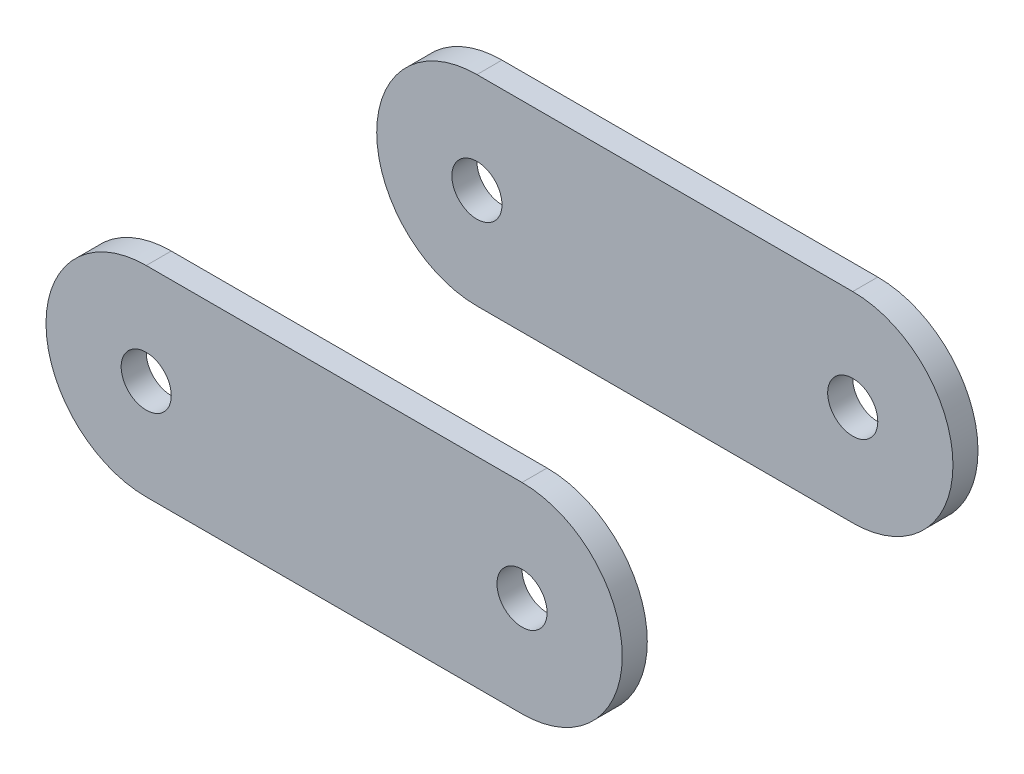
ISO-10303-21;
HEADER;
FILE_DESCRIPTION(('STEP AP214'),'2;1');
FILE_NAME('part.step','',(''),(''),'','','');
FILE_SCHEMA(('AUTOMOTIVE_DESIGN { 1 0 10303 214 1 1 1 1 }'));
ENDSEC;
DATA;
#1=APPLICATION_CONTEXT('core data for automotive mechanical design processes');
#2=APPLICATION_PROTOCOL_DEFINITION('international standard','automotive_design',2000,#1);
#3=PRODUCT_CONTEXT('',#1,'mechanical');
#4=PRODUCT('Part','Part','',(#3));
#5=PRODUCT_RELATED_PRODUCT_CATEGORY('part','',(#4));
#6=PRODUCT_DEFINITION_FORMATION('','',#4);
#7=PRODUCT_DEFINITION_CONTEXT('part definition',#1,'design');
#8=PRODUCT_DEFINITION('design','',#6,#7);
#9=PRODUCT_DEFINITION_SHAPE('','',#8);
#10=(LENGTH_UNIT() NAMED_UNIT(*) SI_UNIT(.MILLI.,.METRE.));
#11=(NAMED_UNIT(*) PLANE_ANGLE_UNIT() SI_UNIT($,.RADIAN.));
#12=(NAMED_UNIT(*) SI_UNIT($,.STERADIAN.) SOLID_ANGLE_UNIT());
#13=UNCERTAINTY_MEASURE_WITH_UNIT(LENGTH_MEASURE(1.E-05),#10,'distance_accuracy_value','');
#14=(GEOMETRIC_REPRESENTATION_CONTEXT(3) GLOBAL_UNCERTAINTY_ASSIGNED_CONTEXT((#13)) GLOBAL_UNIT_ASSIGNED_CONTEXT((#10,
#11,#12)) REPRESENTATION_CONTEXT('',''));
#15=CARTESIAN_POINT('',(0.,0.,0.));
#16=DIRECTION('',(0.,0.,1.));
#17=DIRECTION('',(1.,0.,0.));
#18=AXIS2_PLACEMENT_3D('',#15,#16,#17);
#19=CARTESIAN_POINT('',(0.,20.,-61.));
#20=DIRECTION('',(0.,0.,-1.));
#21=DIRECTION('',(-1.,0.,0.));
#22=AXIS2_PLACEMENT_3D('',#19,#20,#21);
#23=PLANE('',#22);
#24=CARTESIAN_POINT('',(0.,20.,-61.));
#25=DIRECTION('',(0.,0.,1.));
#26=DIRECTION('',(-1.,0.,0.));
#27=AXIS2_PLACEMENT_3D('',#24,#25,#26);
#28=CIRCLE('',#27,20.);
#29=CARTESIAN_POINT('',(0.,40.,-61.));
#30=VERTEX_POINT('',#29);
#31=CARTESIAN_POINT('',(0.,0.,-61.));
#32=VERTEX_POINT('',#31);
#33=EDGE_CURVE('E95',#30,#32,#28,.T.);
#34=ORIENTED_EDGE('',*,*,#33,.T.);
#35=DIRECTION('',(1.,0.,0.));
#36=VECTOR('',#35,1.);
#37=CARTESIAN_POINT('',(0.,0.,-61.));
#38=LINE('',#37,#36);
#39=CARTESIAN_POINT('',(75.,0.,-61.));
#40=VERTEX_POINT('',#39);
#41=EDGE_CURVE('E90',#32,#40,#38,.T.);
#42=ORIENTED_EDGE('',*,*,#41,.T.);
#43=CARTESIAN_POINT('',(75.,20.,-61.));
#44=DIRECTION('',(0.,0.,1.));
#45=DIRECTION('',(1.,0.,0.));
#46=AXIS2_PLACEMENT_3D('',#43,#44,#45);
#47=CIRCLE('',#46,20.);
#48=CARTESIAN_POINT('',(75.,40.,-61.));
#49=VERTEX_POINT('',#48);
#50=EDGE_CURVE('E93',#40,#49,#47,.T.);
#51=ORIENTED_EDGE('',*,*,#50,.T.);
#52=DIRECTION('',(-1.,0.,0.));
#53=VECTOR('',#52,1.);
#54=CARTESIAN_POINT('',(0.,40.,-61.));
#55=LINE('',#54,#53);
#56=EDGE_CURVE('E60',#49,#30,#55,.T.);
#57=ORIENTED_EDGE('',*,*,#56,.T.);
#58=EDGE_LOOP('',(#34,#42,#51,#57));
#59=FACE_BOUND('',#58,.T.);
#60=CARTESIAN_POINT('',(0.,20.,-61.));
#61=DIRECTION('',(0.,0.,1.));
#62=DIRECTION('',(1.,0.,0.));
#63=AXIS2_PLACEMENT_3D('',#60,#61,#62);
#64=CIRCLE('',#63,5.);
#65=CARTESIAN_POINT('',(5.,20.,-61.));
#66=VERTEX_POINT('',#65);
#67=EDGE_CURVE('E110',#66,#66,#64,.T.);
#68=ORIENTED_EDGE('',*,*,#67,.F.);
#69=EDGE_LOOP('',(#68));
#70=FACE_BOUND('',#69,.T.);
#71=CARTESIAN_POINT('',(75.,20.,-61.));
#72=DIRECTION('',(0.,0.,1.));
#73=DIRECTION('',(1.,0.,0.));
#74=AXIS2_PLACEMENT_3D('',#71,#72,#73);
#75=CIRCLE('',#74,5.);
#76=CARTESIAN_POINT('',(80.,20.,-61.));
#77=VERTEX_POINT('',#76);
#78=EDGE_CURVE('E125',#77,#77,#75,.T.);
#79=ORIENTED_EDGE('',*,*,#78,.F.);
#80=EDGE_LOOP('',(#79));
#81=FACE_BOUND('',#80,.T.);
#82=ADVANCED_FACE('F43',(#59,#70,#81),#23,.F.);
#83=CARTESIAN_POINT('',(0.,20.,-66.));
#84=DIRECTION('',(0.,0.,-1.));
#85=DIRECTION('',(-1.,0.,0.));
#86=AXIS2_PLACEMENT_3D('',#83,#84,#85);
#87=PLANE('',#86);
#88=CARTESIAN_POINT('',(0.,20.,-66.));
#89=DIRECTION('',(0.,0.,1.));
#90=DIRECTION('',(1.,0.,0.));
#91=AXIS2_PLACEMENT_3D('',#88,#89,#90);
#92=CIRCLE('',#91,5.);
#93=CARTESIAN_POINT('',(5.,20.,-66.));
#94=VERTEX_POINT('',#93);
#95=EDGE_CURVE('E122',#94,#94,#92,.T.);
#96=ORIENTED_EDGE('',*,*,#95,.T.);
#97=EDGE_LOOP('',(#96));
#98=FACE_BOUND('',#97,.T.);
#99=CARTESIAN_POINT('',(0.,20.,-66.));
#100=DIRECTION('',(0.,0.,1.));
#101=DIRECTION('',(-1.,0.,0.));
#102=AXIS2_PLACEMENT_3D('',#99,#100,#101);
#103=CIRCLE('',#102,20.);
#104=CARTESIAN_POINT('',(0.,40.,-66.));
#105=VERTEX_POINT('',#104);
#106=CARTESIAN_POINT('',(0.,0.,-66.));
#107=VERTEX_POINT('',#106);
#108=EDGE_CURVE('E107',#105,#107,#103,.T.);
#109=ORIENTED_EDGE('',*,*,#108,.F.);
#110=DIRECTION('',(-1.,0.,0.));
#111=VECTOR('',#110,1.);
#112=CARTESIAN_POINT('',(0.,40.,-66.));
#113=LINE('',#112,#111);
#114=CARTESIAN_POINT('',(75.,40.,-66.));
#115=VERTEX_POINT('',#114);
#116=EDGE_CURVE('E83',#115,#105,#113,.T.);
#117=ORIENTED_EDGE('',*,*,#116,.F.);
#118=CARTESIAN_POINT('',(75.,20.,-66.));
#119=DIRECTION('',(0.,0.,1.));
#120=DIRECTION('',(1.,0.,0.));
#121=AXIS2_PLACEMENT_3D('',#118,#119,#120);
#122=CIRCLE('',#121,20.);
#123=CARTESIAN_POINT('',(75.,0.,-66.));
#124=VERTEX_POINT('',#123);
#125=EDGE_CURVE('E77',#124,#115,#122,.T.);
#126=ORIENTED_EDGE('',*,*,#125,.F.);
#127=DIRECTION('',(1.,0.,0.));
#128=VECTOR('',#127,1.);
#129=CARTESIAN_POINT('',(0.,0.,-66.));
#130=LINE('',#129,#128);
#131=EDGE_CURVE('E99',#107,#124,#130,.T.);
#132=ORIENTED_EDGE('',*,*,#131,.F.);
#133=EDGE_LOOP('',(#109,#117,#126,#132));
#134=FACE_BOUND('',#133,.T.);
#135=CARTESIAN_POINT('',(75.,20.,-66.));
#136=DIRECTION('',(0.,0.,1.));
#137=DIRECTION('',(1.,0.,0.));
#138=AXIS2_PLACEMENT_3D('',#135,#136,#137);
#139=CIRCLE('',#138,5.);
#140=CARTESIAN_POINT('',(80.,20.,-66.));
#141=VERTEX_POINT('',#140);
#142=EDGE_CURVE('E128',#141,#141,#139,.T.);
#143=ORIENTED_EDGE('',*,*,#142,.T.);
#144=EDGE_LOOP('',(#143));
#145=FACE_BOUND('',#144,.T.);
#146=ADVANCED_FACE('F118',(#98,#134,#145),#87,.T.);
#147=CARTESIAN_POINT('',(0.,20.,-61.));
#148=DIRECTION('',(0.,0.,-1.));
#149=DIRECTION('',(-1.,0.,0.));
#150=AXIS2_PLACEMENT_3D('',#147,#148,#149);
#151=CYLINDRICAL_SURFACE('',#150,20.);
#152=ORIENTED_EDGE('',*,*,#108,.T.);
#153=DIRECTION('',(0.,0.,-1.));
#154=VECTOR('',#153,1.);
#155=CARTESIAN_POINT('',(0.,0.,-61.));
#156=LINE('',#155,#154);
#157=EDGE_CURVE('E12',#32,#107,#156,.T.);
#158=ORIENTED_EDGE('',*,*,#157,.F.);
#159=ORIENTED_EDGE('',*,*,#33,.F.);
#160=DIRECTION('',(0.,0.,-1.));
#161=VECTOR('',#160,1.);
#162=CARTESIAN_POINT('',(0.,40.,-61.));
#163=LINE('',#162,#161);
#164=EDGE_CURVE('E103',#30,#105,#163,.T.);
#165=ORIENTED_EDGE('',*,*,#164,.T.);
#166=EDGE_LOOP('',(#152,#158,#159,#165));
#167=FACE_BOUND('',#166,.T.);
#168=ADVANCED_FACE('F45',(#167),#151,.T.);
#169=CARTESIAN_POINT('',(0.,0.,-61.));
#170=DIRECTION('',(0.,1.,0.));
#171=DIRECTION('',(0.,0.,1.));
#172=AXIS2_PLACEMENT_3D('',#169,#170,#171);
#173=PLANE('',#172);
#174=ORIENTED_EDGE('',*,*,#131,.T.);
#175=DIRECTION('',(0.,0.,-1.));
#176=VECTOR('',#175,1.);
#177=CARTESIAN_POINT('',(75.,0.,-61.));
#178=LINE('',#177,#176);
#179=EDGE_CURVE('E52',#40,#124,#178,.T.);
#180=ORIENTED_EDGE('',*,*,#179,.F.);
#181=ORIENTED_EDGE('',*,*,#41,.F.);
#182=ORIENTED_EDGE('',*,*,#157,.T.);
#183=EDGE_LOOP('',(#174,#180,#181,#182));
#184=FACE_BOUND('',#183,.T.);
#185=ADVANCED_FACE('F98',(#184),#173,.F.);
#186=CARTESIAN_POINT('',(75.,20.,-61.));
#187=DIRECTION('',(0.,0.,-1.));
#188=DIRECTION('',(-1.,0.,0.));
#189=AXIS2_PLACEMENT_3D('',#186,#187,#188);
#190=CYLINDRICAL_SURFACE('',#189,20.);
#191=ORIENTED_EDGE('',*,*,#125,.T.);
#192=DIRECTION('',(0.,0.,-1.));
#193=VECTOR('',#192,1.);
#194=CARTESIAN_POINT('',(75.,40.,-61.));
#195=LINE('',#194,#193);
#196=EDGE_CURVE('E100',#49,#115,#195,.T.);
#197=ORIENTED_EDGE('',*,*,#196,.F.);
#198=ORIENTED_EDGE('',*,*,#50,.F.);
#199=ORIENTED_EDGE('',*,*,#179,.T.);
#200=EDGE_LOOP('',(#191,#197,#198,#199));
#201=FACE_BOUND('',#200,.T.);
#202=ADVANCED_FACE('F101',(#201),#190,.T.);
#203=CARTESIAN_POINT('',(0.,40.,-61.));
#204=DIRECTION('',(0.,-1.,0.));
#205=DIRECTION('',(0.,0.,-1.));
#206=AXIS2_PLACEMENT_3D('',#203,#204,#205);
#207=PLANE('',#206);
#208=ORIENTED_EDGE('',*,*,#116,.T.);
#209=ORIENTED_EDGE('',*,*,#164,.F.);
#210=ORIENTED_EDGE('',*,*,#56,.F.);
#211=ORIENTED_EDGE('',*,*,#196,.T.);
#212=EDGE_LOOP('',(#208,#209,#210,#211));
#213=FACE_BOUND('',#212,.T.);
#214=ADVANCED_FACE('F115',(#213),#207,.F.);
#215=CARTESIAN_POINT('',(0.,20.,-61.));
#216=DIRECTION('',(0.,0.,-1.));
#217=DIRECTION('',(-1.,0.,0.));
#218=AXIS2_PLACEMENT_3D('',#215,#216,#217);
#219=CYLINDRICAL_SURFACE('',#218,5.);
#220=ORIENTED_EDGE('',*,*,#67,.T.);
#221=EDGE_LOOP('',(#220));
#222=FACE_BOUND('',#221,.T.);
#223=ORIENTED_EDGE('',*,*,#95,.F.);
#224=EDGE_LOOP('',(#223));
#225=FACE_BOUND('',#224,.T.);
#226=ADVANCED_FACE('F145',(#222,#225),#219,.F.);
#227=CARTESIAN_POINT('',(75.,20.,-61.));
#228=DIRECTION('',(0.,0.,-1.));
#229=DIRECTION('',(-1.,0.,0.));
#230=AXIS2_PLACEMENT_3D('',#227,#228,#229);
#231=CYLINDRICAL_SURFACE('',#230,5.);
#232=ORIENTED_EDGE('',*,*,#78,.T.);
#233=EDGE_LOOP('',(#232));
#234=FACE_BOUND('',#233,.T.);
#235=ORIENTED_EDGE('',*,*,#142,.F.);
#236=EDGE_LOOP('',(#235));
#237=FACE_BOUND('',#236,.T.);
#238=ADVANCED_FACE('F134',(#234,#237),#231,.F.);
#239=CLOSED_SHELL('',(#82,#146,#168,#185,#202,#214,#226,#238));
#240=MANIFOLD_SOLID_BREP('B2',#239);
#241=CARTESIAN_POINT('',(0.,20.,5.));
#242=DIRECTION('',(0.,0.,-1.));
#243=DIRECTION('',(-1.,0.,0.));
#244=AXIS2_PLACEMENT_3D('',#241,#242,#243);
#245=PLANE('',#244);
#246=CARTESIAN_POINT('',(0.,20.,5.));
#247=DIRECTION('',(0.,0.,1.));
#248=DIRECTION('',(-1.,0.,0.));
#249=AXIS2_PLACEMENT_3D('',#246,#247,#248);
#250=CIRCLE('',#249,20.);
#251=CARTESIAN_POINT('',(0.,40.,5.));
#252=VERTEX_POINT('',#251);
#253=CARTESIAN_POINT('',(0.,0.,5.));
#254=VERTEX_POINT('',#253);
#255=EDGE_CURVE('E261',#252,#254,#250,.T.);
#256=ORIENTED_EDGE('',*,*,#255,.T.);
#257=DIRECTION('',(1.,0.,0.));
#258=VECTOR('',#257,1.);
#259=CARTESIAN_POINT('',(0.,0.,5.));
#260=LINE('',#259,#258);
#261=CARTESIAN_POINT('',(75.,0.,5.));
#262=VERTEX_POINT('',#261);
#263=EDGE_CURVE('E256',#254,#262,#260,.T.);
#264=ORIENTED_EDGE('',*,*,#263,.T.);
#265=CARTESIAN_POINT('',(75.,20.,5.));
#266=DIRECTION('',(0.,0.,1.));
#267=DIRECTION('',(1.,0.,0.));
#268=AXIS2_PLACEMENT_3D('',#265,#266,#267);
#269=CIRCLE('',#268,20.);
#270=CARTESIAN_POINT('',(75.,40.,5.));
#271=VERTEX_POINT('',#270);
#272=EDGE_CURVE('E259',#262,#271,#269,.T.);
#273=ORIENTED_EDGE('',*,*,#272,.T.);
#274=DIRECTION('',(-1.,0.,0.));
#275=VECTOR('',#274,1.);
#276=CARTESIAN_POINT('',(0.,40.,5.));
#277=LINE('',#276,#275);
#278=EDGE_CURVE('E226',#271,#252,#277,.T.);
#279=ORIENTED_EDGE('',*,*,#278,.T.);
#280=EDGE_LOOP('',(#256,#264,#273,#279));
#281=FACE_BOUND('',#280,.T.);
#282=CARTESIAN_POINT('',(0.,20.,5.));
#283=DIRECTION('',(0.,0.,1.));
#284=DIRECTION('',(1.,0.,0.));
#285=AXIS2_PLACEMENT_3D('',#282,#283,#284);
#286=CIRCLE('',#285,5.);
#287=CARTESIAN_POINT('',(5.,20.,5.));
#288=VERTEX_POINT('',#287);
#289=EDGE_CURVE('E276',#288,#288,#286,.T.);
#290=ORIENTED_EDGE('',*,*,#289,.F.);
#291=EDGE_LOOP('',(#290));
#292=FACE_BOUND('',#291,.T.);
#293=CARTESIAN_POINT('',(75.,20.,5.));
#294=DIRECTION('',(0.,0.,1.));
#295=DIRECTION('',(1.,0.,0.));
#296=AXIS2_PLACEMENT_3D('',#293,#294,#295);
#297=CIRCLE('',#296,5.);
#298=CARTESIAN_POINT('',(80.,20.,5.));
#299=VERTEX_POINT('',#298);
#300=EDGE_CURVE('E291',#299,#299,#297,.T.);
#301=ORIENTED_EDGE('',*,*,#300,.F.);
#302=EDGE_LOOP('',(#301));
#303=FACE_BOUND('',#302,.T.);
#304=ADVANCED_FACE('F209',(#281,#292,#303),#245,.F.);
#305=CARTESIAN_POINT('',(0.,20.,0.));
#306=DIRECTION('',(0.,0.,-1.));
#307=DIRECTION('',(-1.,0.,0.));
#308=AXIS2_PLACEMENT_3D('',#305,#306,#307);
#309=PLANE('',#308);
#310=CARTESIAN_POINT('',(0.,20.,0.));
#311=DIRECTION('',(0.,0.,1.));
#312=DIRECTION('',(1.,0.,0.));
#313=AXIS2_PLACEMENT_3D('',#310,#311,#312);
#314=CIRCLE('',#313,5.);
#315=CARTESIAN_POINT('',(5.,20.,0.));
#316=VERTEX_POINT('',#315);
#317=EDGE_CURVE('E288',#316,#316,#314,.T.);
#318=ORIENTED_EDGE('',*,*,#317,.T.);
#319=EDGE_LOOP('',(#318));
#320=FACE_BOUND('',#319,.T.);
#321=CARTESIAN_POINT('',(0.,20.,0.));
#322=DIRECTION('',(0.,0.,1.));
#323=DIRECTION('',(-1.,0.,0.));
#324=AXIS2_PLACEMENT_3D('',#321,#322,#323);
#325=CIRCLE('',#324,20.);
#326=CARTESIAN_POINT('',(0.,40.,0.));
#327=VERTEX_POINT('',#326);
#328=CARTESIAN_POINT('',(0.,0.,0.));
#329=VERTEX_POINT('',#328);
#330=EDGE_CURVE('E273',#327,#329,#325,.T.);
#331=ORIENTED_EDGE('',*,*,#330,.F.);
#332=DIRECTION('',(-1.,0.,0.));
#333=VECTOR('',#332,1.);
#334=CARTESIAN_POINT('',(0.,40.,0.));
#335=LINE('',#334,#333);
#336=CARTESIAN_POINT('',(75.,40.,0.));
#337=VERTEX_POINT('',#336);
#338=EDGE_CURVE('E249',#337,#327,#335,.T.);
#339=ORIENTED_EDGE('',*,*,#338,.F.);
#340=CARTESIAN_POINT('',(75.,20.,0.));
#341=DIRECTION('',(0.,0.,1.));
#342=DIRECTION('',(1.,0.,0.));
#343=AXIS2_PLACEMENT_3D('',#340,#341,#342);
#344=CIRCLE('',#343,20.);
#345=CARTESIAN_POINT('',(75.,0.,0.));
#346=VERTEX_POINT('',#345);
#347=EDGE_CURVE('E243',#346,#337,#344,.T.);
#348=ORIENTED_EDGE('',*,*,#347,.F.);
#349=DIRECTION('',(1.,0.,0.));
#350=VECTOR('',#349,1.);
#351=CARTESIAN_POINT('',(0.,0.,0.));
#352=LINE('',#351,#350);
#353=EDGE_CURVE('E265',#329,#346,#352,.T.);
#354=ORIENTED_EDGE('',*,*,#353,.F.);
#355=EDGE_LOOP('',(#331,#339,#348,#354));
#356=FACE_BOUND('',#355,.T.);
#357=CARTESIAN_POINT('',(75.,20.,0.));
#358=DIRECTION('',(0.,0.,1.));
#359=DIRECTION('',(1.,0.,0.));
#360=AXIS2_PLACEMENT_3D('',#357,#358,#359);
#361=CIRCLE('',#360,5.);
#362=CARTESIAN_POINT('',(80.,20.,0.));
#363=VERTEX_POINT('',#362);
#364=EDGE_CURVE('E294',#363,#363,#361,.T.);
#365=ORIENTED_EDGE('',*,*,#364,.T.);
#366=EDGE_LOOP('',(#365));
#367=FACE_BOUND('',#366,.T.);
#368=ADVANCED_FACE('F284',(#320,#356,#367),#309,.T.);
#369=CARTESIAN_POINT('',(0.,20.,5.));
#370=DIRECTION('',(0.,0.,-1.));
#371=DIRECTION('',(-1.,0.,0.));
#372=AXIS2_PLACEMENT_3D('',#369,#370,#371);
#373=CYLINDRICAL_SURFACE('',#372,20.);
#374=ORIENTED_EDGE('',*,*,#330,.T.);
#375=DIRECTION('',(0.,0.,-1.));
#376=VECTOR('',#375,1.);
#377=CARTESIAN_POINT('',(0.,0.,5.));
#378=LINE('',#377,#376);
#379=EDGE_CURVE('E41',#254,#329,#378,.T.);
#380=ORIENTED_EDGE('',*,*,#379,.F.);
#381=ORIENTED_EDGE('',*,*,#255,.F.);
#382=DIRECTION('',(0.,0.,-1.));
#383=VECTOR('',#382,1.);
#384=CARTESIAN_POINT('',(0.,40.,5.));
#385=LINE('',#384,#383);
#386=EDGE_CURVE('E269',#252,#327,#385,.T.);
#387=ORIENTED_EDGE('',*,*,#386,.T.);
#388=EDGE_LOOP('',(#374,#380,#381,#387));
#389=FACE_BOUND('',#388,.T.);
#390=ADVANCED_FACE('F211',(#389),#373,.T.);
#391=CARTESIAN_POINT('',(0.,0.,5.));
#392=DIRECTION('',(0.,1.,0.));
#393=DIRECTION('',(0.,0.,1.));
#394=AXIS2_PLACEMENT_3D('',#391,#392,#393);
#395=PLANE('',#394);
#396=ORIENTED_EDGE('',*,*,#353,.T.);
#397=DIRECTION('',(0.,0.,-1.));
#398=VECTOR('',#397,1.);
#399=CARTESIAN_POINT('',(75.,0.,5.));
#400=LINE('',#399,#398);
#401=EDGE_CURVE('E218',#262,#346,#400,.T.);
#402=ORIENTED_EDGE('',*,*,#401,.F.);
#403=ORIENTED_EDGE('',*,*,#263,.F.);
#404=ORIENTED_EDGE('',*,*,#379,.T.);
#405=EDGE_LOOP('',(#396,#402,#403,#404));
#406=FACE_BOUND('',#405,.T.);
#407=ADVANCED_FACE('F264',(#406),#395,.F.);
#408=CARTESIAN_POINT('',(75.,20.,5.));
#409=DIRECTION('',(0.,0.,-1.));
#410=DIRECTION('',(-1.,0.,0.));
#411=AXIS2_PLACEMENT_3D('',#408,#409,#410);
#412=CYLINDRICAL_SURFACE('',#411,20.);
#413=ORIENTED_EDGE('',*,*,#347,.T.);
#414=DIRECTION('',(0.,0.,-1.));
#415=VECTOR('',#414,1.);
#416=CARTESIAN_POINT('',(75.,40.,5.));
#417=LINE('',#416,#415);
#418=EDGE_CURVE('E266',#271,#337,#417,.T.);
#419=ORIENTED_EDGE('',*,*,#418,.F.);
#420=ORIENTED_EDGE('',*,*,#272,.F.);
#421=ORIENTED_EDGE('',*,*,#401,.T.);
#422=EDGE_LOOP('',(#413,#419,#420,#421));
#423=FACE_BOUND('',#422,.T.);
#424=ADVANCED_FACE('F267',(#423),#412,.T.);
#425=CARTESIAN_POINT('',(0.,40.,5.));
#426=DIRECTION('',(0.,-1.,0.));
#427=DIRECTION('',(0.,0.,-1.));
#428=AXIS2_PLACEMENT_3D('',#425,#426,#427);
#429=PLANE('',#428);
#430=ORIENTED_EDGE('',*,*,#338,.T.);
#431=ORIENTED_EDGE('',*,*,#386,.F.);
#432=ORIENTED_EDGE('',*,*,#278,.F.);
#433=ORIENTED_EDGE('',*,*,#418,.T.);
#434=EDGE_LOOP('',(#430,#431,#432,#433));
#435=FACE_BOUND('',#434,.T.);
#436=ADVANCED_FACE('F281',(#435),#429,.F.);
#437=CARTESIAN_POINT('',(0.,20.,5.));
#438=DIRECTION('',(0.,0.,-1.));
#439=DIRECTION('',(-1.,0.,0.));
#440=AXIS2_PLACEMENT_3D('',#437,#438,#439);
#441=CYLINDRICAL_SURFACE('',#440,5.);
#442=ORIENTED_EDGE('',*,*,#289,.T.);
#443=EDGE_LOOP('',(#442));
#444=FACE_BOUND('',#443,.T.);
#445=ORIENTED_EDGE('',*,*,#317,.F.);
#446=EDGE_LOOP('',(#445));
#447=FACE_BOUND('',#446,.T.);
#448=ADVANCED_FACE('F311',(#444,#447),#441,.F.);
#449=CARTESIAN_POINT('',(75.,20.,5.));
#450=DIRECTION('',(0.,0.,-1.));
#451=DIRECTION('',(-1.,0.,0.));
#452=AXIS2_PLACEMENT_3D('',#449,#450,#451);
#453=CYLINDRICAL_SURFACE('',#452,5.);
#454=ORIENTED_EDGE('',*,*,#300,.T.);
#455=EDGE_LOOP('',(#454));
#456=FACE_BOUND('',#455,.T.);
#457=ORIENTED_EDGE('',*,*,#364,.F.);
#458=EDGE_LOOP('',(#457));
#459=FACE_BOUND('',#458,.T.);
#460=ADVANCED_FACE('F300',(#456,#459),#453,.F.);
#461=CLOSED_SHELL('',(#304,#368,#390,#407,#424,#436,#448,#460));
#462=MANIFOLD_SOLID_BREP('B6',#461);
#463=ADVANCED_BREP_SHAPE_REPRESENTATION('',(#18,#240,#462),#14);
#464=SHAPE_DEFINITION_REPRESENTATION(#9,#463);
ENDSEC;
END-ISO-10303-21;
